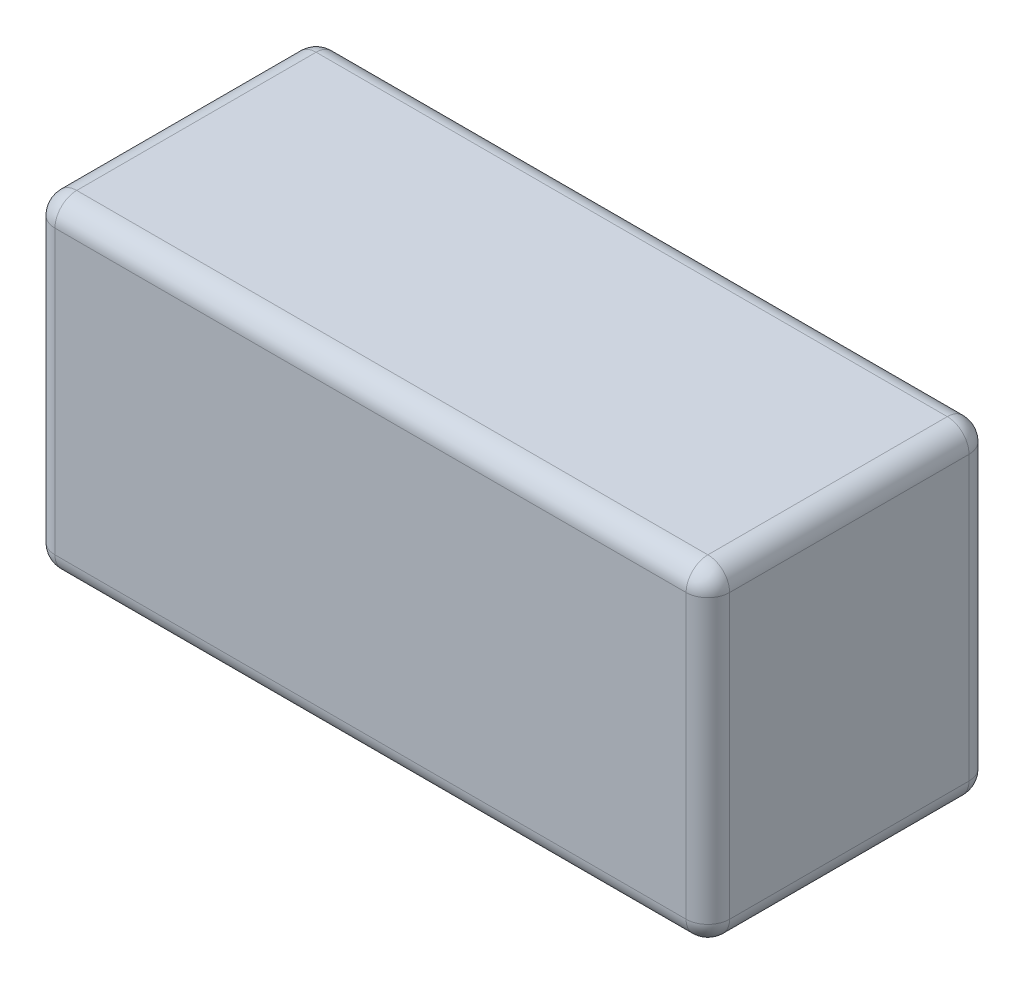
ISO-10303-21;
HEADER;
FILE_DESCRIPTION(('STEP AP214'),'2;1');
FILE_NAME('part.step','',(''),(''),'','','');
FILE_SCHEMA(('AUTOMOTIVE_DESIGN { 1 0 10303 214 1 1 1 1 }'));
ENDSEC;
DATA;
#1=APPLICATION_CONTEXT('core data for automotive mechanical design processes');
#2=APPLICATION_PROTOCOL_DEFINITION('international standard','automotive_design',2000,#1);
#3=PRODUCT_CONTEXT('',#1,'mechanical');
#4=PRODUCT('Part','Part','',(#3));
#5=PRODUCT_RELATED_PRODUCT_CATEGORY('part','',(#4));
#6=PRODUCT_DEFINITION_FORMATION('','',#4);
#7=PRODUCT_DEFINITION_CONTEXT('part definition',#1,'design');
#8=PRODUCT_DEFINITION('design','',#6,#7);
#9=PRODUCT_DEFINITION_SHAPE('','',#8);
#10=(LENGTH_UNIT() NAMED_UNIT(*) SI_UNIT(.MILLI.,.METRE.));
#11=(NAMED_UNIT(*) PLANE_ANGLE_UNIT() SI_UNIT($,.RADIAN.));
#12=(NAMED_UNIT(*) SI_UNIT($,.STERADIAN.) SOLID_ANGLE_UNIT());
#13=UNCERTAINTY_MEASURE_WITH_UNIT(LENGTH_MEASURE(1.E-05),#10,'distance_accuracy_value','');
#14=(GEOMETRIC_REPRESENTATION_CONTEXT(3) GLOBAL_UNCERTAINTY_ASSIGNED_CONTEXT((#13)) GLOBAL_UNIT_ASSIGNED_CONTEXT((#10,
#11,#12)) REPRESENTATION_CONTEXT('',''));
#15=CARTESIAN_POINT('',(0.,0.,0.));
#16=DIRECTION('',(0.,0.,1.));
#17=DIRECTION('',(1.,0.,0.));
#18=AXIS2_PLACEMENT_3D('',#15,#16,#17);
#19=CARTESIAN_POINT('',(0.,0.,1.35));
#20=DIRECTION('',(0.,0.,1.));
#21=DIRECTION('',(1.,0.,0.));
#22=AXIS2_PLACEMENT_3D('',#19,#20,#21);
#23=PLANE('',#22);
#24=DIRECTION('',(0.,1.,0.));
#25=VECTOR('',#24,1.);
#26=CARTESIAN_POINT('',(-1.45,0.375,1.35));
#27=LINE('',#26,#25);
#28=CARTESIAN_POINT('',(-1.45,-0.65,1.35));
#29=VERTEX_POINT('',#28);
#30=CARTESIAN_POINT('',(-1.45,0.65,1.35));
#31=VERTEX_POINT('',#30);
#32=EDGE_CURVE('E160',#29,#31,#27,.T.);
#33=ORIENTED_EDGE('',*,*,#32,.F.);
#34=DIRECTION('',(-1.,0.,0.));
#35=VECTOR('',#34,1.);
#36=CARTESIAN_POINT('',(-0.775,-0.65,1.35));
#37=LINE('',#36,#35);
#38=CARTESIAN_POINT('',(1.45,-0.65,1.35));
#39=VERTEX_POINT('',#38);
#40=EDGE_CURVE('E133',#39,#29,#37,.T.);
#41=ORIENTED_EDGE('',*,*,#40,.F.);
#42=DIRECTION('',(0.,-1.,0.));
#43=VECTOR('',#42,1.);
#44=CARTESIAN_POINT('',(1.45,-0.375,1.35));
#45=LINE('',#44,#43);
#46=CARTESIAN_POINT('',(1.45,0.65,1.35));
#47=VERTEX_POINT('',#46);
#48=EDGE_CURVE('E193',#47,#39,#45,.T.);
#49=ORIENTED_EDGE('',*,*,#48,.F.);
#50=DIRECTION('',(1.,0.,0.));
#51=VECTOR('',#50,1.);
#52=CARTESIAN_POINT('',(0.775,0.65,1.35));
#53=LINE('',#52,#51);
#54=EDGE_CURVE('E11',#31,#47,#53,.T.);
#55=ORIENTED_EDGE('',*,*,#54,.F.);
#56=EDGE_LOOP('',(#33,#41,#49,#55));
#57=FACE_BOUND('',#56,.T.);
#58=ADVANCED_FACE('F16',(#57),#23,.T.);
#59=CARTESIAN_POINT('',(0.775,0.65,1.25));
#60=DIRECTION('',(-1.,0.,0.));
#61=DIRECTION('',(0.,0.707106781186548,0.707106781186548));
#62=AXIS2_PLACEMENT_3D('',#59,#60,#61);
#63=CYLINDRICAL_SURFACE('',#62,0.1);
#64=CARTESIAN_POINT('',(-1.45,0.65,1.25));
#65=DIRECTION('',(-1.,0.,0.));
#66=DIRECTION('',(0.,0.707106781186548,0.707106781186548));
#67=AXIS2_PLACEMENT_3D('',#64,#65,#66);
#68=CIRCLE('',#67,0.1);
#69=CARTESIAN_POINT('',(-1.45,0.75,1.25));
#70=VERTEX_POINT('',#69);
#71=EDGE_CURVE('E166',#31,#70,#68,.T.);
#72=ORIENTED_EDGE('',*,*,#71,.F.);
#73=ORIENTED_EDGE('',*,*,#54,.T.);
#74=CARTESIAN_POINT('',(1.45,0.65,1.25));
#75=DIRECTION('',(1.,0.,0.));
#76=DIRECTION('',(0.,0.707106781186548,0.707106781186548));
#77=AXIS2_PLACEMENT_3D('',#74,#75,#76);
#78=CIRCLE('',#77,0.1);
#79=CARTESIAN_POINT('',(1.45,0.75,1.25));
#80=VERTEX_POINT('',#79);
#81=EDGE_CURVE('E229',#80,#47,#78,.T.);
#82=ORIENTED_EDGE('',*,*,#81,.F.);
#83=DIRECTION('',(-1.,0.,0.));
#84=VECTOR('',#83,1.);
#85=CARTESIAN_POINT('',(0.775,0.75,1.25));
#86=LINE('',#85,#84);
#87=EDGE_CURVE('E20',#80,#70,#86,.T.);
#88=ORIENTED_EDGE('',*,*,#87,.T.);
#89=EDGE_LOOP('',(#72,#73,#82,#88));
#90=FACE_BOUND('',#89,.T.);
#91=ADVANCED_FACE('F335',(#90),#63,.T.);
#92=CARTESIAN_POINT('',(1.55,0.75,0.));
#93=DIRECTION('',(0.,1.,0.));
#94=DIRECTION('',(1.,0.,0.));
#95=AXIS2_PLACEMENT_3D('',#92,#93,#94);
#96=PLANE('',#95);
#97=DIRECTION('',(0.,0.,-1.));
#98=VECTOR('',#97,1.);
#99=CARTESIAN_POINT('',(-1.45,0.75,0.));
#100=LINE('',#99,#98);
#101=CARTESIAN_POINT('',(-1.45,0.75,0.15));
#102=VERTEX_POINT('',#101);
#103=EDGE_CURVE('E196',#70,#102,#100,.T.);
#104=ORIENTED_EDGE('',*,*,#103,.F.);
#105=ORIENTED_EDGE('',*,*,#87,.F.);
#106=DIRECTION('',(0.,0.,1.));
#107=VECTOR('',#106,1.);
#108=CARTESIAN_POINT('',(1.45,0.75,0.));
#109=LINE('',#108,#107);
#110=CARTESIAN_POINT('',(1.45,0.75,0.15));
#111=VERTEX_POINT('',#110);
#112=EDGE_CURVE('E192',#111,#80,#109,.T.);
#113=ORIENTED_EDGE('',*,*,#112,.F.);
#114=DIRECTION('',(1.,0.,0.));
#115=VECTOR('',#114,1.);
#116=CARTESIAN_POINT('',(-0.48457670665,0.75,0.15));
#117=LINE('',#116,#115);
#118=EDGE_CURVE('E222',#102,#111,#117,.T.);
#119=ORIENTED_EDGE('',*,*,#118,.F.);
#120=EDGE_LOOP('',(#104,#105,#113,#119));
#121=FACE_BOUND('',#120,.T.);
#122=ADVANCED_FACE('F347',(#121),#96,.T.);
#123=CARTESIAN_POINT('',(1.55,-0.75,0.));
#124=DIRECTION('',(1.,0.,0.));
#125=DIRECTION('',(0.,1.,0.));
#126=AXIS2_PLACEMENT_3D('',#123,#124,#125);
#127=PLANE('',#126);
#128=DIRECTION('',(0.,1.,0.));
#129=VECTOR('',#128,1.);
#130=CARTESIAN_POINT('',(1.55,-0.375,1.25));
#131=LINE('',#130,#129);
#132=CARTESIAN_POINT('',(1.55,-0.65,1.25));
#133=VERTEX_POINT('',#132);
#134=CARTESIAN_POINT('',(1.55,0.65,1.25));
#135=VERTEX_POINT('',#134);
#136=EDGE_CURVE('E186',#133,#135,#131,.T.);
#137=ORIENTED_EDGE('',*,*,#136,.F.);
#138=DIRECTION('',(0.,0.,1.));
#139=VECTOR('',#138,1.);
#140=CARTESIAN_POINT('',(1.55,-0.65,0.));
#141=LINE('',#140,#139);
#142=CARTESIAN_POINT('',(1.55,-0.65,0.15));
#143=VERTEX_POINT('',#142);
#144=EDGE_CURVE('E40',#143,#133,#141,.T.);
#145=ORIENTED_EDGE('',*,*,#144,.F.);
#146=DIRECTION('',(0.,-1.,0.));
#147=VECTOR('',#146,1.);
#148=CARTESIAN_POINT('',(1.55,0.,0.15));
#149=LINE('',#148,#147);
#150=CARTESIAN_POINT('',(1.55,0.65,0.15));
#151=VERTEX_POINT('',#150);
#152=EDGE_CURVE('E266',#151,#143,#149,.T.);
#153=ORIENTED_EDGE('',*,*,#152,.F.);
#154=DIRECTION('',(0.,0.,-1.));
#155=VECTOR('',#154,1.);
#156=CARTESIAN_POINT('',(1.55,0.65,0.));
#157=LINE('',#156,#155);
#158=EDGE_CURVE('E231',#135,#151,#157,.T.);
#159=ORIENTED_EDGE('',*,*,#158,.F.);
#160=EDGE_LOOP('',(#137,#145,#153,#159));
#161=FACE_BOUND('',#160,.T.);
#162=ADVANCED_FACE('F521',(#161),#127,.T.);
#163=CARTESIAN_POINT('',(-0.48457670665,0.65,0.15));
#164=DIRECTION('',(-1.,0.,0.));
#165=DIRECTION('',(0.,0.707106781186548,-0.707106781186548));
#166=AXIS2_PLACEMENT_3D('',#163,#164,#165);
#167=CYLINDRICAL_SURFACE('',#166,0.1);
#168=CARTESIAN_POINT('',(-1.45,0.65,0.15));
#169=DIRECTION('',(-1.,0.,0.));
#170=DIRECTION('',(0.,0.707106781186548,-0.707106781186548));
#171=AXIS2_PLACEMENT_3D('',#168,#169,#170);
#172=CIRCLE('',#171,0.1);
#173=CARTESIAN_POINT('',(-1.45,0.65,0.05));
#174=VERTEX_POINT('',#173);
#175=EDGE_CURVE('E201',#102,#174,#172,.T.);
#176=ORIENTED_EDGE('',*,*,#175,.F.);
#177=ORIENTED_EDGE('',*,*,#118,.T.);
#178=CARTESIAN_POINT('',(1.45,0.65,0.15));
#179=DIRECTION('',(1.,0.,0.));
#180=DIRECTION('',(0.,0.707106781186548,-0.707106781186548));
#181=AXIS2_PLACEMENT_3D('',#178,#179,#180);
#182=CIRCLE('',#181,0.1);
#183=CARTESIAN_POINT('',(1.45,0.65,0.05));
#184=VERTEX_POINT('',#183);
#185=EDGE_CURVE('E220',#184,#111,#182,.T.);
#186=ORIENTED_EDGE('',*,*,#185,.F.);
#187=DIRECTION('',(-1.,0.,0.));
#188=VECTOR('',#187,1.);
#189=CARTESIAN_POINT('',(-0.48457670665,0.65,0.05));
#190=LINE('',#189,#188);
#191=EDGE_CURVE('E103',#184,#174,#190,.T.);
#192=ORIENTED_EDGE('',*,*,#191,.T.);
#193=EDGE_LOOP('',(#176,#177,#186,#192));
#194=FACE_BOUND('',#193,.T.);
#195=ADVANCED_FACE('F524',(#194),#167,.T.);
#196=CARTESIAN_POINT('',(1.45,-0.65,1.25));
#197=DIRECTION('',(-0.408248290463863,-0.816496580927726,-0.408248290463863));
#198=DIRECTION('',(0.577350269189626,-0.577350269189626,0.577350269189626));
#199=AXIS2_PLACEMENT_3D('',#196,#197,#198);
#200=SPHERICAL_SURFACE('',#199,0.1);
#201=CARTESIAN_POINT('',(1.45,-0.65,1.25));
#202=DIRECTION('',(0.,1.,0.));
#203=DIRECTION('',(0.,0.,1.));
#204=AXIS2_PLACEMENT_3D('',#201,#202,#203);
#205=CIRCLE('',#204,0.1);
#206=EDGE_CURVE('E182',#39,#133,#205,.T.);
#207=ORIENTED_EDGE('',*,*,#206,.F.);
#208=CARTESIAN_POINT('',(1.45,-0.65,1.25));
#209=DIRECTION('',(1.,0.,0.));
#210=DIRECTION('',(0.,-0.707106781186548,0.707106781186548));
#211=AXIS2_PLACEMENT_3D('',#208,#209,#210);
#212=CIRCLE('',#211,0.1);
#213=CARTESIAN_POINT('',(1.45,-0.75,1.25));
#214=VERTEX_POINT('',#213);
#215=EDGE_CURVE('E139',#39,#214,#212,.T.);
#216=ORIENTED_EDGE('',*,*,#215,.T.);
#217=CARTESIAN_POINT('',(1.45,-0.65,1.25));
#218=DIRECTION('',(0.,0.,-1.));
#219=DIRECTION('',(1.,0.,0.));
#220=AXIS2_PLACEMENT_3D('',#217,#218,#219);
#221=CIRCLE('',#220,0.1);
#222=EDGE_CURVE('E225',#133,#214,#221,.T.);
#223=ORIENTED_EDGE('',*,*,#222,.F.);
#224=EDGE_LOOP('',(#207,#216,#223));
#225=FACE_BOUND('',#224,.T.);
#226=ADVANCED_FACE('F321',(#225),#200,.T.);
#227=CARTESIAN_POINT('',(1.45,-0.65,0.15));
#228=DIRECTION('',(-0.408248290463863,-0.816496580927726,0.408248290463863));
#229=DIRECTION('',(0.577350269189626,-0.577350269189626,-0.577350269189626));
#230=AXIS2_PLACEMENT_3D('',#227,#228,#229);
#231=SPHERICAL_SURFACE('',#230,0.1);
#232=CARTESIAN_POINT('',(1.45,-0.65,0.15));
#233=DIRECTION('',(0.,0.,1.));
#234=DIRECTION('',(0.,-1.,0.));
#235=AXIS2_PLACEMENT_3D('',#232,#233,#234);
#236=CIRCLE('',#235,0.1);
#237=CARTESIAN_POINT('',(1.45,-0.75,0.15));
#238=VERTEX_POINT('',#237);
#239=EDGE_CURVE('E218',#238,#143,#236,.T.);
#240=ORIENTED_EDGE('',*,*,#239,.F.);
#241=CARTESIAN_POINT('',(1.45,-0.65,0.15));
#242=DIRECTION('',(1.,0.,0.));
#243=DIRECTION('',(0.,-0.707106781186548,-0.707106781186548));
#244=AXIS2_PLACEMENT_3D('',#241,#242,#243);
#245=CIRCLE('',#244,0.1);
#246=CARTESIAN_POINT('',(1.45,-0.65,0.05));
#247=VERTEX_POINT('',#246);
#248=EDGE_CURVE('E249',#238,#247,#245,.T.);
#249=ORIENTED_EDGE('',*,*,#248,.T.);
#250=CARTESIAN_POINT('',(1.45,-0.65,0.15));
#251=DIRECTION('',(0.,1.,0.));
#252=DIRECTION('',(1.,0.,0.));
#253=AXIS2_PLACEMENT_3D('',#250,#251,#252);
#254=CIRCLE('',#253,0.1);
#255=EDGE_CURVE('E226',#143,#247,#254,.T.);
#256=ORIENTED_EDGE('',*,*,#255,.F.);
#257=EDGE_LOOP('',(#240,#249,#256));
#258=FACE_BOUND('',#257,.T.);
#259=ADVANCED_FACE('F517',(#258),#231,.T.);
#260=CARTESIAN_POINT('',(1.45,-0.65,0.));
#261=DIRECTION('',(0.,0.,1.));
#262=DIRECTION('',(0.707106781186548,-0.707106781186548,0.));
#263=AXIS2_PLACEMENT_3D('',#260,#261,#262);
#264=CYLINDRICAL_SURFACE('',#263,0.1);
#265=ORIENTED_EDGE('',*,*,#239,.T.);
#266=ORIENTED_EDGE('',*,*,#144,.T.);
#267=ORIENTED_EDGE('',*,*,#222,.T.);
#268=DIRECTION('',(0.,0.,-1.));
#269=VECTOR('',#268,1.);
#270=CARTESIAN_POINT('',(1.45,-0.75,0.));
#271=LINE('',#270,#269);
#272=EDGE_CURVE('E209',#214,#238,#271,.T.);
#273=ORIENTED_EDGE('',*,*,#272,.T.);
#274=EDGE_LOOP('',(#265,#266,#267,#273));
#275=FACE_BOUND('',#274,.T.);
#276=ADVANCED_FACE('F316',(#275),#264,.T.);
#277=CARTESIAN_POINT('',(1.45,0.65,0.15));
#278=DIRECTION('',(-0.816496580927726,0.408248290463863,-0.408248290463863));
#279=DIRECTION('',(0.577350269189626,0.577350269189626,-0.577350269189626));
#280=AXIS2_PLACEMENT_3D('',#277,#278,#279);
#281=SPHERICAL_SURFACE('',#280,0.1);
#282=CARTESIAN_POINT('',(1.45,0.65,0.15));
#283=DIRECTION('',(0.,-1.,0.));
#284=DIRECTION('',(0.,0.,-1.));
#285=AXIS2_PLACEMENT_3D('',#282,#283,#284);
#286=CIRCLE('',#285,0.1);
#287=EDGE_CURVE('E228',#184,#151,#286,.T.);
#288=ORIENTED_EDGE('',*,*,#287,.F.);
#289=ORIENTED_EDGE('',*,*,#185,.T.);
#290=CARTESIAN_POINT('',(1.45,0.65,0.15));
#291=DIRECTION('',(0.,0.,1.));
#292=DIRECTION('',(1.,0.,0.));
#293=AXIS2_PLACEMENT_3D('',#290,#291,#292);
#294=CIRCLE('',#293,0.1);
#295=EDGE_CURVE('E188',#151,#111,#294,.T.);
#296=ORIENTED_EDGE('',*,*,#295,.F.);
#297=EDGE_LOOP('',(#288,#289,#296));
#298=FACE_BOUND('',#297,.T.);
#299=ADVANCED_FACE('F523',(#298),#281,.T.);
#300=CARTESIAN_POINT('',(1.45,0.,0.15));
#301=DIRECTION('',(0.,1.,0.));
#302=DIRECTION('',(0.707106781186548,0.,-0.707106781186548));
#303=AXIS2_PLACEMENT_3D('',#300,#301,#302);
#304=CYLINDRICAL_SURFACE('',#303,0.1);
#305=ORIENTED_EDGE('',*,*,#255,.T.);
#306=DIRECTION('',(0.,1.,0.));
#307=VECTOR('',#306,1.);
#308=CARTESIAN_POINT('',(1.45,0.,0.05));
#309=LINE('',#308,#307);
#310=EDGE_CURVE('E187',#247,#184,#309,.T.);
#311=ORIENTED_EDGE('',*,*,#310,.T.);
#312=ORIENTED_EDGE('',*,*,#287,.T.);
#313=ORIENTED_EDGE('',*,*,#152,.T.);
#314=EDGE_LOOP('',(#305,#311,#312,#313));
#315=FACE_BOUND('',#314,.T.);
#316=ADVANCED_FACE('F18',(#315),#304,.T.);
#317=CARTESIAN_POINT('',(1.45,0.65,1.25));
#318=DIRECTION('',(0.408248290463863,0.408248290463863,-0.816496580927726));
#319=DIRECTION('',(0.577350269189626,0.577350269189626,0.577350269189626));
#320=AXIS2_PLACEMENT_3D('',#317,#318,#319);
#321=SPHERICAL_SURFACE('',#320,0.1);
#322=CARTESIAN_POINT('',(1.45,0.65,1.25));
#323=DIRECTION('',(0.,0.,-1.));
#324=DIRECTION('',(0.,1.,0.));
#325=AXIS2_PLACEMENT_3D('',#322,#323,#324);
#326=CIRCLE('',#325,0.1);
#327=EDGE_CURVE('E235',#80,#135,#326,.T.);
#328=ORIENTED_EDGE('',*,*,#327,.F.);
#329=ORIENTED_EDGE('',*,*,#81,.T.);
#330=CARTESIAN_POINT('',(1.45,0.65,1.25));
#331=DIRECTION('',(0.,-1.,0.));
#332=DIRECTION('',(1.,0.,0.));
#333=AXIS2_PLACEMENT_3D('',#330,#331,#332);
#334=CIRCLE('',#333,0.1);
#335=EDGE_CURVE('E200',#135,#47,#334,.T.);
#336=ORIENTED_EDGE('',*,*,#335,.F.);
#337=EDGE_LOOP('',(#328,#329,#336));
#338=FACE_BOUND('',#337,.T.);
#339=ADVANCED_FACE('F340',(#338),#321,.T.);
#340=CARTESIAN_POINT('',(1.45,0.65,0.));
#341=DIRECTION('',(0.,0.,1.));
#342=DIRECTION('',(0.707106781186548,0.707106781186548,0.));
#343=AXIS2_PLACEMENT_3D('',#340,#341,#342);
#344=CYLINDRICAL_SURFACE('',#343,0.1);
#345=ORIENTED_EDGE('',*,*,#295,.T.);
#346=ORIENTED_EDGE('',*,*,#112,.T.);
#347=ORIENTED_EDGE('',*,*,#327,.T.);
#348=ORIENTED_EDGE('',*,*,#158,.T.);
#349=EDGE_LOOP('',(#345,#346,#347,#348));
#350=FACE_BOUND('',#349,.T.);
#351=ADVANCED_FACE('F343',(#350),#344,.T.);
#352=CARTESIAN_POINT('',(1.45,-0.375,1.25));
#353=DIRECTION('',(0.,1.,0.));
#354=DIRECTION('',(0.707106781186548,0.,0.707106781186548));
#355=AXIS2_PLACEMENT_3D('',#352,#353,#354);
#356=CYLINDRICAL_SURFACE('',#355,0.1);
#357=ORIENTED_EDGE('',*,*,#206,.T.);
#358=ORIENTED_EDGE('',*,*,#136,.T.);
#359=ORIENTED_EDGE('',*,*,#335,.T.);
#360=ORIENTED_EDGE('',*,*,#48,.T.);
#361=EDGE_LOOP('',(#357,#358,#359,#360));
#362=FACE_BOUND('',#361,.T.);
#363=ADVANCED_FACE('F324',(#362),#356,.T.);
#364=CARTESIAN_POINT('',(-1.55,0.75,0.));
#365=DIRECTION('',(-1.,0.,0.));
#366=DIRECTION('',(0.,0.,1.));
#367=AXIS2_PLACEMENT_3D('',#364,#365,#366);
#368=PLANE('',#367);
#369=DIRECTION('',(0.,0.,1.));
#370=VECTOR('',#369,1.);
#371=CARTESIAN_POINT('',(-1.55,0.65,0.));
#372=LINE('',#371,#370);
#373=CARTESIAN_POINT('',(-1.55,0.65,0.15));
#374=VERTEX_POINT('',#373);
#375=CARTESIAN_POINT('',(-1.55,0.65,1.25));
#376=VERTEX_POINT('',#375);
#377=EDGE_CURVE('E217',#374,#376,#372,.T.);
#378=ORIENTED_EDGE('',*,*,#377,.F.);
#379=DIRECTION('',(0.,1.,0.));
#380=VECTOR('',#379,1.);
#381=CARTESIAN_POINT('',(-1.55,0.75,0.15));
#382=LINE('',#381,#380);
#383=CARTESIAN_POINT('',(-1.55,-0.65,0.15));
#384=VERTEX_POINT('',#383);
#385=EDGE_CURVE('E250',#384,#374,#382,.T.);
#386=ORIENTED_EDGE('',*,*,#385,.F.);
#387=DIRECTION('',(0.,0.,-1.));
#388=VECTOR('',#387,1.);
#389=CARTESIAN_POINT('',(-1.55,-0.65,0.));
#390=LINE('',#389,#388);
#391=CARTESIAN_POINT('',(-1.55,-0.65,1.25));
#392=VERTEX_POINT('',#391);
#393=EDGE_CURVE('E157',#392,#384,#390,.T.);
#394=ORIENTED_EDGE('',*,*,#393,.F.);
#395=DIRECTION('',(0.,-1.,0.));
#396=VECTOR('',#395,1.);
#397=CARTESIAN_POINT('',(-1.55,0.375,1.25));
#398=LINE('',#397,#396);
#399=EDGE_CURVE('E170',#376,#392,#398,.T.);
#400=ORIENTED_EDGE('',*,*,#399,.F.);
#401=EDGE_LOOP('',(#378,#386,#394,#400));
#402=FACE_BOUND('',#401,.T.);
#403=ADVANCED_FACE('F503',(#402),#368,.T.);
#404=CARTESIAN_POINT('',(-2.5191534133,0.75,0.05));
#405=DIRECTION('',(0.,0.,1.));
#406=DIRECTION('',(1.,0.,0.));
#407=AXIS2_PLACEMENT_3D('',#404,#405,#406);
#408=PLANE('',#407);
#409=DIRECTION('',(0.,-1.,0.));
#410=VECTOR('',#409,1.);
#411=CARTESIAN_POINT('',(-1.45,0.75,0.05));
#412=LINE('',#411,#410);
#413=CARTESIAN_POINT('',(-1.45,-0.65,0.05));
#414=VERTEX_POINT('',#413);
#415=EDGE_CURVE('E239',#174,#414,#412,.T.);
#416=ORIENTED_EDGE('',*,*,#415,.F.);
#417=ORIENTED_EDGE('',*,*,#191,.F.);
#418=ORIENTED_EDGE('',*,*,#310,.F.);
#419=DIRECTION('',(1.,0.,0.));
#420=VECTOR('',#419,1.);
#421=CARTESIAN_POINT('',(-2.03457670665,-0.65,0.05));
#422=LINE('',#421,#420);
#423=EDGE_CURVE('E213',#414,#247,#422,.T.);
#424=ORIENTED_EDGE('',*,*,#423,.F.);
#425=EDGE_LOOP('',(#416,#417,#418,#424));
#426=FACE_BOUND('',#425,.T.);
#427=ADVANCED_FACE('F535',(#426),#408,.F.);
#428=CARTESIAN_POINT('',(-2.03457670665,-0.65,0.15));
#429=DIRECTION('',(1.,0.,0.));
#430=DIRECTION('',(0.,-0.707106781186548,-0.707106781186548));
#431=AXIS2_PLACEMENT_3D('',#428,#429,#430);
#432=CYLINDRICAL_SURFACE('',#431,0.1);
#433=CARTESIAN_POINT('',(-1.45,-0.65,0.15));
#434=DIRECTION('',(-1.,0.,0.));
#435=DIRECTION('',(0.,-0.707106781186548,-0.707106781186548));
#436=AXIS2_PLACEMENT_3D('',#433,#434,#435);
#437=CIRCLE('',#436,0.1);
#438=CARTESIAN_POINT('',(-1.45,-0.75,0.15));
#439=VERTEX_POINT('',#438);
#440=EDGE_CURVE('E204',#414,#439,#437,.T.);
#441=ORIENTED_EDGE('',*,*,#440,.F.);
#442=ORIENTED_EDGE('',*,*,#423,.T.);
#443=ORIENTED_EDGE('',*,*,#248,.F.);
#444=DIRECTION('',(-1.,0.,0.));
#445=VECTOR('',#444,1.);
#446=CARTESIAN_POINT('',(-2.03457670665,-0.75,0.15));
#447=LINE('',#446,#445);
#448=EDGE_CURVE('E144',#238,#439,#447,.T.);
#449=ORIENTED_EDGE('',*,*,#448,.T.);
#450=EDGE_LOOP('',(#441,#442,#443,#449));
#451=FACE_BOUND('',#450,.T.);
#452=ADVANCED_FACE('F512',(#451),#432,.T.);
#453=CARTESIAN_POINT('',(-1.55,-0.75,0.));
#454=DIRECTION('',(0.,-1.,0.));
#455=DIRECTION('',(0.,0.,-1.));
#456=AXIS2_PLACEMENT_3D('',#453,#454,#455);
#457=PLANE('',#456);
#458=DIRECTION('',(0.,0.,1.));
#459=VECTOR('',#458,1.);
#460=CARTESIAN_POINT('',(-1.45,-0.75,0.));
#461=LINE('',#460,#459);
#462=CARTESIAN_POINT('',(-1.45,-0.75,1.25));
#463=VERTEX_POINT('',#462);
#464=EDGE_CURVE('E258',#439,#463,#461,.T.);
#465=ORIENTED_EDGE('',*,*,#464,.F.);
#466=ORIENTED_EDGE('',*,*,#448,.F.);
#467=ORIENTED_EDGE('',*,*,#272,.F.);
#468=DIRECTION('',(1.,0.,0.));
#469=VECTOR('',#468,1.);
#470=CARTESIAN_POINT('',(-0.775,-0.75,1.25));
#471=LINE('',#470,#469);
#472=EDGE_CURVE('E117',#463,#214,#471,.T.);
#473=ORIENTED_EDGE('',*,*,#472,.F.);
#474=EDGE_LOOP('',(#465,#466,#467,#473));
#475=FACE_BOUND('',#474,.T.);
#476=ADVANCED_FACE('F320',(#475),#457,.T.);
#477=CARTESIAN_POINT('',(-0.775,-0.65,1.25));
#478=DIRECTION('',(1.,0.,0.));
#479=DIRECTION('',(0.,-0.707106781186548,0.707106781186548));
#480=AXIS2_PLACEMENT_3D('',#477,#478,#479);
#481=CYLINDRICAL_SURFACE('',#480,0.1);
#482=CARTESIAN_POINT('',(-1.45,-0.65,1.25));
#483=DIRECTION('',(-1.,0.,0.));
#484=DIRECTION('',(0.,-0.707106781186548,0.707106781186548));
#485=AXIS2_PLACEMENT_3D('',#482,#483,#484);
#486=CIRCLE('',#485,0.1);
#487=EDGE_CURVE('E136',#463,#29,#486,.T.);
#488=ORIENTED_EDGE('',*,*,#487,.F.);
#489=ORIENTED_EDGE('',*,*,#472,.T.);
#490=ORIENTED_EDGE('',*,*,#215,.F.);
#491=ORIENTED_EDGE('',*,*,#40,.T.);
#492=EDGE_LOOP('',(#488,#489,#490,#491));
#493=FACE_BOUND('',#492,.T.);
#494=ADVANCED_FACE('F135',(#493),#481,.T.);
#495=CARTESIAN_POINT('',(-1.45,0.65,0.15));
#496=DIRECTION('',(-0.816496580927726,-0.408248290463863,0.408248290463863));
#497=DIRECTION('',(-0.577350269189626,0.577350269189626,-0.577350269189626));
#498=AXIS2_PLACEMENT_3D('',#495,#496,#497);
#499=SPHERICAL_SURFACE('',#498,0.1);
#500=CARTESIAN_POINT('',(-1.45,0.65,0.15));
#501=DIRECTION('',(0.,0.,1.));
#502=DIRECTION('',(0.,1.,0.));
#503=AXIS2_PLACEMENT_3D('',#500,#501,#502);
#504=CIRCLE('',#503,0.1);
#505=EDGE_CURVE('E262',#102,#374,#504,.T.);
#506=ORIENTED_EDGE('',*,*,#505,.F.);
#507=ORIENTED_EDGE('',*,*,#175,.T.);
#508=CARTESIAN_POINT('',(-1.45,0.65,0.15));
#509=DIRECTION('',(0.,-1.,0.));
#510=DIRECTION('',(-1.,0.,0.));
#511=AXIS2_PLACEMENT_3D('',#508,#509,#510);
#512=CIRCLE('',#511,0.1);
#513=EDGE_CURVE('E156',#374,#174,#512,.T.);
#514=ORIENTED_EDGE('',*,*,#513,.F.);
#515=EDGE_LOOP('',(#506,#507,#514));
#516=FACE_BOUND('',#515,.T.);
#517=ADVANCED_FACE('F531',(#516),#499,.T.);
#518=CARTESIAN_POINT('',(-1.45,-0.65,0.15));
#519=DIRECTION('',(0.408248290463863,0.408248290463863,-0.816496580927726));
#520=DIRECTION('',(-0.577350269189626,-0.577350269189626,-0.577350269189626));
#521=AXIS2_PLACEMENT_3D('',#518,#519,#520);
#522=SPHERICAL_SURFACE('',#521,0.1);
#523=CARTESIAN_POINT('',(-1.45,-0.65,0.15));
#524=DIRECTION('',(0.,1.,0.));
#525=DIRECTION('',(0.,0.,-1.));
#526=AXIS2_PLACEMENT_3D('',#523,#524,#525);
#527=CIRCLE('',#526,0.1);
#528=EDGE_CURVE('E253',#414,#384,#527,.T.);
#529=ORIENTED_EDGE('',*,*,#528,.F.);
#530=ORIENTED_EDGE('',*,*,#440,.T.);
#531=CARTESIAN_POINT('',(-1.45,-0.65,0.15));
#532=DIRECTION('',(0.,0.,1.));
#533=DIRECTION('',(-1.,0.,0.));
#534=AXIS2_PLACEMENT_3D('',#531,#532,#533);
#535=CIRCLE('',#534,0.1);
#536=EDGE_CURVE('E254',#384,#439,#535,.T.);
#537=ORIENTED_EDGE('',*,*,#536,.F.);
#538=EDGE_LOOP('',(#529,#530,#537));
#539=FACE_BOUND('',#538,.T.);
#540=ADVANCED_FACE('F509',(#539),#522,.T.);
#541=CARTESIAN_POINT('',(-1.45,0.75,0.15));
#542=DIRECTION('',(0.,-1.,0.));
#543=DIRECTION('',(-0.707106781186548,0.,-0.707106781186548));
#544=AXIS2_PLACEMENT_3D('',#541,#542,#543);
#545=CYLINDRICAL_SURFACE('',#544,0.1);
#546=ORIENTED_EDGE('',*,*,#513,.T.);
#547=ORIENTED_EDGE('',*,*,#415,.T.);
#548=ORIENTED_EDGE('',*,*,#528,.T.);
#549=ORIENTED_EDGE('',*,*,#385,.T.);
#550=EDGE_LOOP('',(#546,#547,#548,#549));
#551=FACE_BOUND('',#550,.T.);
#552=ADVANCED_FACE('F533',(#551),#545,.T.);
#553=CARTESIAN_POINT('',(-1.45,-0.65,1.25));
#554=DIRECTION('',(0.408248290463863,-0.816496580927726,-0.408248290463863));
#555=DIRECTION('',(-0.577350269189626,-0.577350269189626,0.577350269189626));
#556=AXIS2_PLACEMENT_3D('',#553,#554,#555);
#557=SPHERICAL_SURFACE('',#556,0.1);
#558=CARTESIAN_POINT('',(-1.45,-0.65,1.25));
#559=DIRECTION('',(0.,0.,-1.));
#560=DIRECTION('',(0.,-1.,0.));
#561=AXIS2_PLACEMENT_3D('',#558,#559,#560);
#562=CIRCLE('',#561,0.1);
#563=EDGE_CURVE('E153',#463,#392,#562,.T.);
#564=ORIENTED_EDGE('',*,*,#563,.F.);
#565=ORIENTED_EDGE('',*,*,#487,.T.);
#566=CARTESIAN_POINT('',(-1.45,-0.65,1.25));
#567=DIRECTION('',(0.,1.,0.));
#568=DIRECTION('',(-1.,0.,0.));
#569=AXIS2_PLACEMENT_3D('',#566,#567,#568);
#570=CIRCLE('',#569,0.1);
#571=EDGE_CURVE('E150',#392,#29,#570,.T.);
#572=ORIENTED_EDGE('',*,*,#571,.F.);
#573=EDGE_LOOP('',(#564,#565,#572));
#574=FACE_BOUND('',#573,.T.);
#575=ADVANCED_FACE('F148',(#574),#557,.T.);
#576=CARTESIAN_POINT('',(-1.45,-0.65,0.));
#577=DIRECTION('',(0.,0.,1.));
#578=DIRECTION('',(-0.707106781186548,-0.707106781186548,0.));
#579=AXIS2_PLACEMENT_3D('',#576,#577,#578);
#580=CYLINDRICAL_SURFACE('',#579,0.1);
#581=ORIENTED_EDGE('',*,*,#536,.T.);
#582=ORIENTED_EDGE('',*,*,#464,.T.);
#583=ORIENTED_EDGE('',*,*,#563,.T.);
#584=ORIENTED_EDGE('',*,*,#393,.T.);
#585=EDGE_LOOP('',(#581,#582,#583,#584));
#586=FACE_BOUND('',#585,.T.);
#587=ADVANCED_FACE('F506',(#586),#580,.T.);
#588=CARTESIAN_POINT('',(-1.45,0.65,1.25));
#589=DIRECTION('',(-0.408248290463863,-0.816496580927726,0.408248290463863));
#590=DIRECTION('',(-0.577350269189626,0.577350269189626,0.577350269189626));
#591=AXIS2_PLACEMENT_3D('',#588,#589,#590);
#592=SPHERICAL_SURFACE('',#591,0.1);
#593=CARTESIAN_POINT('',(-1.45,0.65,1.25));
#594=DIRECTION('',(0.,-1.,0.));
#595=DIRECTION('',(0.,0.,1.));
#596=AXIS2_PLACEMENT_3D('',#593,#594,#595);
#597=CIRCLE('',#596,0.1);
#598=EDGE_CURVE('E177',#31,#376,#597,.T.);
#599=ORIENTED_EDGE('',*,*,#598,.F.);
#600=ORIENTED_EDGE('',*,*,#71,.T.);
#601=CARTESIAN_POINT('',(-1.45,0.65,1.25));
#602=DIRECTION('',(0.,0.,-1.));
#603=DIRECTION('',(-1.,0.,0.));
#604=AXIS2_PLACEMENT_3D('',#601,#602,#603);
#605=CIRCLE('',#604,0.1);
#606=EDGE_CURVE('E207',#376,#70,#605,.T.);
#607=ORIENTED_EDGE('',*,*,#606,.F.);
#608=EDGE_LOOP('',(#599,#600,#607));
#609=FACE_BOUND('',#608,.T.);
#610=ADVANCED_FACE('F499',(#609),#592,.T.);
#611=CARTESIAN_POINT('',(-1.45,0.375,1.25));
#612=DIRECTION('',(0.,-1.,0.));
#613=DIRECTION('',(-0.707106781186548,0.,0.707106781186548));
#614=AXIS2_PLACEMENT_3D('',#611,#612,#613);
#615=CYLINDRICAL_SURFACE('',#614,0.1);
#616=ORIENTED_EDGE('',*,*,#598,.T.);
#617=ORIENTED_EDGE('',*,*,#399,.T.);
#618=ORIENTED_EDGE('',*,*,#571,.T.);
#619=ORIENTED_EDGE('',*,*,#32,.T.);
#620=EDGE_LOOP('',(#616,#617,#618,#619));
#621=FACE_BOUND('',#620,.T.);
#622=ADVANCED_FACE('F168',(#621),#615,.T.);
#623=CARTESIAN_POINT('',(-1.45,0.65,0.));
#624=DIRECTION('',(0.,0.,1.));
#625=DIRECTION('',(-0.707106781186548,0.707106781186548,0.));
#626=AXIS2_PLACEMENT_3D('',#623,#624,#625);
#627=CYLINDRICAL_SURFACE('',#626,0.1);
#628=ORIENTED_EDGE('',*,*,#505,.T.);
#629=ORIENTED_EDGE('',*,*,#377,.T.);
#630=ORIENTED_EDGE('',*,*,#606,.T.);
#631=ORIENTED_EDGE('',*,*,#103,.T.);
#632=EDGE_LOOP('',(#628,#629,#630,#631));
#633=FACE_BOUND('',#632,.T.);
#634=ADVANCED_FACE('F530',(#633),#627,.T.);
#635=CLOSED_SHELL('',(#58,#91,#122,#162,#195,#226,#259,#276,#299,#316,#339,#351,#363,#403,#427,
#452,#476,#494,#517,#540,#552,#575,#587,#610,#622,#634));
#636=MANIFOLD_SOLID_BREP('B1',#635);
#637=ADVANCED_BREP_SHAPE_REPRESENTATION('',(#18,#636),#14);
#638=SHAPE_DEFINITION_REPRESENTATION(#9,#637);
ENDSEC;
END-ISO-10303-21;
